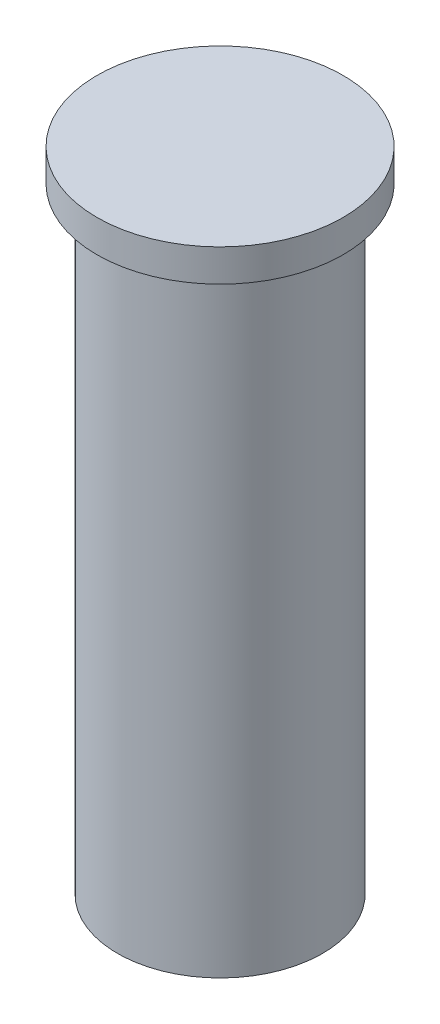
ISO-10303-21;
HEADER;
FILE_DESCRIPTION(('STEP AP214'),'2;1');
FILE_NAME('part.step','',(''),(''),'','','');
FILE_SCHEMA(('AUTOMOTIVE_DESIGN { 1 0 10303 214 1 1 1 1 }'));
ENDSEC;
DATA;
#1=APPLICATION_CONTEXT('core data for automotive mechanical design processes');
#2=APPLICATION_PROTOCOL_DEFINITION('international standard','automotive_design',2000,#1);
#3=PRODUCT_CONTEXT('',#1,'mechanical');
#4=PRODUCT('Part','Part','',(#3));
#5=PRODUCT_RELATED_PRODUCT_CATEGORY('part','',(#4));
#6=PRODUCT_DEFINITION_FORMATION('','',#4);
#7=PRODUCT_DEFINITION_CONTEXT('part definition',#1,'design');
#8=PRODUCT_DEFINITION('design','',#6,#7);
#9=PRODUCT_DEFINITION_SHAPE('','',#8);
#10=(LENGTH_UNIT() NAMED_UNIT(*) SI_UNIT(.MILLI.,.METRE.));
#11=(NAMED_UNIT(*) PLANE_ANGLE_UNIT() SI_UNIT($,.RADIAN.));
#12=(NAMED_UNIT(*) SI_UNIT($,.STERADIAN.) SOLID_ANGLE_UNIT());
#13=UNCERTAINTY_MEASURE_WITH_UNIT(LENGTH_MEASURE(1.E-05),#10,'distance_accuracy_value','');
#14=(GEOMETRIC_REPRESENTATION_CONTEXT(3) GLOBAL_UNCERTAINTY_ASSIGNED_CONTEXT((#13)) GLOBAL_UNIT_ASSIGNED_CONTEXT((#10,
#11,#12)) REPRESENTATION_CONTEXT('',''));
#15=CARTESIAN_POINT('',(0.,0.,0.));
#16=DIRECTION('',(0.,0.,1.));
#17=DIRECTION('',(1.,0.,0.));
#18=AXIS2_PLACEMENT_3D('',#15,#16,#17);
#19=CARTESIAN_POINT('',(0.,38.1,0.));
#20=DIRECTION('',(0.,-1.,0.));
#21=DIRECTION('',(0.,0.,-1.));
#22=AXIS2_PLACEMENT_3D('',#19,#20,#21);
#23=CYLINDRICAL_SURFACE('',#22,6.35);
#24=CARTESIAN_POINT('',(0.,38.1,0.));
#25=DIRECTION('',(0.,1.,0.));
#26=DIRECTION('',(0.,0.,1.));
#27=AXIS2_PLACEMENT_3D('',#24,#25,#26);
#28=CIRCLE('',#27,6.35);
#29=CARTESIAN_POINT('',(0.,38.1,-6.35));
#30=VERTEX_POINT('',#29);
#31=EDGE_CURVE('E10',#30,#30,#28,.T.);
#32=CARTESIAN_POINT('',(0.,0.,0.));
#33=DIRECTION('',(0.,1.,0.));
#34=DIRECTION('',(0.,0.,1.));
#35=AXIS2_PLACEMENT_3D('',#32,#33,#34);
#36=CIRCLE('',#35,6.35);
#37=CARTESIAN_POINT('',(0.,0.,-6.35));
#38=VERTEX_POINT('',#37);
#39=EDGE_CURVE('E34',#38,#38,#36,.T.);
#40=CARTESIAN_POINT('',(0.,38.1,-6.35));
#41=CARTESIAN_POINT('',(0.,37.703125,-6.35));
#42=CARTESIAN_POINT('',(0.,37.30625,-6.35));
#43=CARTESIAN_POINT('',(0.,36.5125,-6.35));
#44=CARTESIAN_POINT('',(0.,36.115625,-6.35));
#45=CARTESIAN_POINT('',(0.,35.321875,-6.35));
#46=CARTESIAN_POINT('',(0.,34.925,-6.35));
#47=CARTESIAN_POINT('',(0.,34.13125,-6.35));
#48=CARTESIAN_POINT('',(0.,33.734375,-6.35));
#49=CARTESIAN_POINT('',(0.,32.940625,-6.35));
#50=CARTESIAN_POINT('',(0.,32.54375,-6.35));
#51=CARTESIAN_POINT('',(0.,31.75,-6.35));
#52=CARTESIAN_POINT('',(0.,31.353125,-6.35));
#53=CARTESIAN_POINT('',(0.,30.559375,-6.35));
#54=CARTESIAN_POINT('',(0.,30.1625,-6.35));
#55=CARTESIAN_POINT('',(0.,29.36875,-6.35));
#56=CARTESIAN_POINT('',(0.,28.971875,-6.35));
#57=CARTESIAN_POINT('',(0.,28.178125,-6.35));
#58=CARTESIAN_POINT('',(0.,27.78125,-6.35));
#59=CARTESIAN_POINT('',(0.,26.9875,-6.35));
#60=CARTESIAN_POINT('',(0.,26.590625,-6.35));
#61=CARTESIAN_POINT('',(0.,25.796875,-6.35));
#62=CARTESIAN_POINT('',(0.,25.4,-6.35));
#63=CARTESIAN_POINT('',(0.,24.60625,-6.35));
#64=CARTESIAN_POINT('',(0.,24.209375,-6.35));
#65=CARTESIAN_POINT('',(0.,23.415625,-6.35));
#66=CARTESIAN_POINT('',(0.,23.01875,-6.35));
#67=CARTESIAN_POINT('',(0.,22.225,-6.35));
#68=CARTESIAN_POINT('',(0.,21.828125,-6.35));
#69=CARTESIAN_POINT('',(0.,21.034375,-6.35));
#70=CARTESIAN_POINT('',(0.,20.6375,-6.35));
#71=CARTESIAN_POINT('',(0.,19.84375,-6.35));
#72=CARTESIAN_POINT('',(0.,19.446875,-6.35));
#73=CARTESIAN_POINT('',(0.,18.653125,-6.35));
#74=CARTESIAN_POINT('',(0.,18.25625,-6.35));
#75=CARTESIAN_POINT('',(0.,17.4625,-6.35));
#76=CARTESIAN_POINT('',(0.,17.065625,-6.35));
#77=CARTESIAN_POINT('',(0.,16.271875,-6.35));
#78=CARTESIAN_POINT('',(0.,15.875,-6.35));
#79=CARTESIAN_POINT('',(0.,15.08125,-6.35));
#80=CARTESIAN_POINT('',(0.,14.684375,-6.35));
#81=CARTESIAN_POINT('',(0.,13.890625,-6.35));
#82=CARTESIAN_POINT('',(0.,13.49375,-6.35));
#83=CARTESIAN_POINT('',(0.,12.7,-6.35));
#84=CARTESIAN_POINT('',(0.,12.303125,-6.35));
#85=CARTESIAN_POINT('',(0.,11.509375,-6.35));
#86=CARTESIAN_POINT('',(0.,11.1125,-6.35));
#87=CARTESIAN_POINT('',(0.,10.31875,-6.35));
#88=CARTESIAN_POINT('',(0.,9.921875,-6.35));
#89=CARTESIAN_POINT('',(0.,9.128125,-6.35));
#90=CARTESIAN_POINT('',(0.,8.73125,-6.35));
#91=CARTESIAN_POINT('',(0.,7.9375,-6.35));
#92=CARTESIAN_POINT('',(0.,7.540625,-6.35));
#93=CARTESIAN_POINT('',(0.,6.746875,-6.35));
#94=CARTESIAN_POINT('',(0.,6.35,-6.35));
#95=CARTESIAN_POINT('',(0.,5.55625,-6.35));
#96=CARTESIAN_POINT('',(0.,5.159375,-6.35));
#97=CARTESIAN_POINT('',(0.,4.365625,-6.35));
#98=CARTESIAN_POINT('',(0.,3.96875,-6.35));
#99=CARTESIAN_POINT('',(0.,3.175,-6.35));
#100=CARTESIAN_POINT('',(0.,2.778125,-6.35));
#101=CARTESIAN_POINT('',(0.,1.984375,-6.35));
#102=CARTESIAN_POINT('',(0.,1.5875,-6.35));
#103=CARTESIAN_POINT('',(0.,0.79375,-6.35));
#104=CARTESIAN_POINT('',(0.,0.396875,-6.35));
#105=CARTESIAN_POINT('',(0.,0.,-6.35));
#106=B_SPLINE_CURVE_WITH_KNOTS('',3,(#40,#41,#42,#43,#44,#45,#46,#47,#48,#49,#50,#51,#52,#53,
#54,#55,#56,#57,#58,#59,#60,#61,#62,#63,#64,#65,#66,#67,#68,#69,#70,#71,#72,#73,#74,#75,#76,#77,
#78,#79,#80,#81,#82,#83,#84,#85,#86,#87,#88,#89,#90,#91,#92,#93,#94,#95,#96,#97,#98,#99,#100,
#101,#102,#103,#104,#105),.UNSPECIFIED.,.F.,.F.,(4,2,2,2,2,2,2,2,2,2,2,2,2,2,2,2,2,2,2,2,2,2,2,
2,2,2,2,2,2,2,2,2,4),(0.,1.19062499999999,2.38124999999999,3.571875,4.7625,5.953125,7.14375,
8.33437499999999,9.525,10.715625,11.90625,13.096875,14.2875,15.478125,16.66875,17.859375,19.05,
20.240625,21.43125,22.621875,23.8125,25.003125,26.19375,27.384375,28.575,29.765625,30.95625,
32.146875,33.3375,34.528125,35.71875,36.909375,38.1),.UNSPECIFIED.);
#107=EDGE_CURVE('BSEAM31',#30,#38,#106,.T.);
#108=ORIENTED_EDGE('',*,*,#31,.F.);
#109=ORIENTED_EDGE('',*,*,#39,.T.);
#110=ORIENTED_EDGE('',*,*,#107,.T.);
#111=ORIENTED_EDGE('',*,*,#107,.F.);
#112=EDGE_LOOP('',(#108,#110,#109,#111));
#113=FACE_BOUND('',#112,.T.);
#114=ADVANCED_FACE('F31',(#113),#23,.T.);
#115=CARTESIAN_POINT('',(0.,0.,0.));
#116=DIRECTION('',(0.,1.,0.));
#117=DIRECTION('',(0.,0.,1.));
#118=AXIS2_PLACEMENT_3D('',#115,#116,#117);
#119=PLANE('',#118);
#120=ORIENTED_EDGE('',*,*,#39,.F.);
#121=EDGE_LOOP('',(#120));
#122=FACE_BOUND('',#121,.T.);
#123=ADVANCED_FACE('F54',(#122),#119,.F.);
#124=CARTESIAN_POINT('',(0.,40.1,0.));
#125=DIRECTION('',(0.,-1.,0.));
#126=DIRECTION('',(0.,0.,-1.));
#127=AXIS2_PLACEMENT_3D('',#124,#125,#126);
#128=CYLINDRICAL_SURFACE('',#127,7.62);
#129=CARTESIAN_POINT('',(0.,40.1,0.));
#130=DIRECTION('',(0.,1.,0.));
#131=DIRECTION('',(0.,0.,1.));
#132=AXIS2_PLACEMENT_3D('',#129,#130,#131);
#133=CIRCLE('',#132,7.62);
#134=CARTESIAN_POINT('',(0.,40.1,7.62));
#135=VERTEX_POINT('',#134);
#136=EDGE_CURVE('E41',#135,#135,#133,.T.);
#137=ORIENTED_EDGE('',*,*,#136,.F.);
#138=EDGE_LOOP('',(#137));
#139=FACE_BOUND('',#138,.T.);
#140=CARTESIAN_POINT('',(0.,38.1,0.));
#141=DIRECTION('',(0.,1.,0.));
#142=DIRECTION('',(0.,0.,1.));
#143=AXIS2_PLACEMENT_3D('',#140,#141,#142);
#144=CIRCLE('',#143,7.62);
#145=CARTESIAN_POINT('',(0.,38.1,7.62));
#146=VERTEX_POINT('',#145);
#147=EDGE_CURVE('E43',#146,#146,#144,.T.);
#148=ORIENTED_EDGE('',*,*,#147,.T.);
#149=EDGE_LOOP('',(#148));
#150=FACE_BOUND('',#149,.T.);
#151=ADVANCED_FACE('F51',(#139,#150),#128,.T.);
#152=CARTESIAN_POINT('',(0.,40.1,0.));
#153=DIRECTION('',(0.,1.,0.));
#154=DIRECTION('',(0.,0.,1.));
#155=AXIS2_PLACEMENT_3D('',#152,#153,#154);
#156=PLANE('',#155);
#157=ORIENTED_EDGE('',*,*,#136,.T.);
#158=EDGE_LOOP('',(#157));
#159=FACE_BOUND('',#158,.T.);
#160=ADVANCED_FACE('F49',(#159),#156,.T.);
#161=CARTESIAN_POINT('',(0.,38.1,0.));
#162=DIRECTION('',(0.,1.,0.));
#163=DIRECTION('',(0.,0.,1.));
#164=AXIS2_PLACEMENT_3D('',#161,#162,#163);
#165=PLANE('',#164);
#166=ORIENTED_EDGE('',*,*,#31,.T.);
#167=EDGE_LOOP('',(#166));
#168=FACE_BOUND('',#167,.T.);
#169=ORIENTED_EDGE('',*,*,#147,.F.);
#170=EDGE_LOOP('',(#169));
#171=FACE_BOUND('',#170,.T.);
#172=ADVANCED_FACE('F58',(#168,#171),#165,.F.);
#173=CLOSED_SHELL('',(#114,#123,#151,#160,#172));
#174=MANIFOLD_SOLID_BREP('B2',#173);
#175=ADVANCED_BREP_SHAPE_REPRESENTATION('',(#18,#174),#14);
#176=SHAPE_DEFINITION_REPRESENTATION(#9,#175);
ENDSEC;
END-ISO-10303-21;
